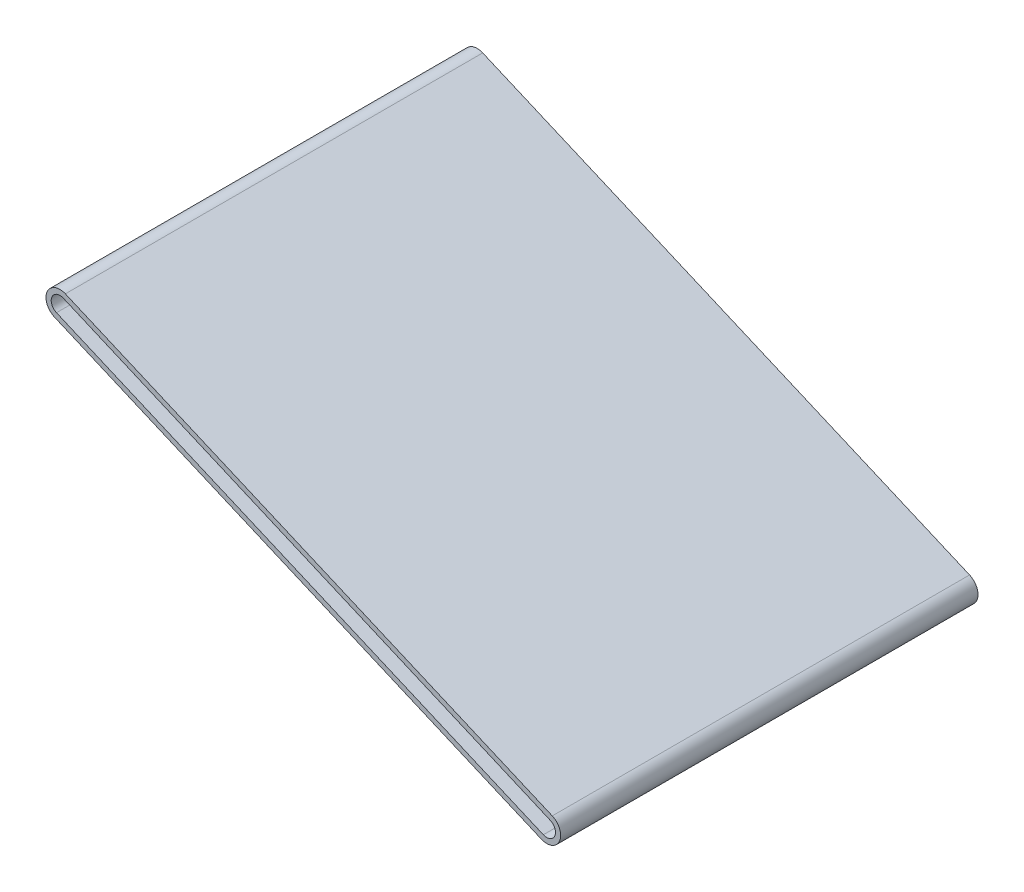
ISO-10303-21;
HEADER;
FILE_DESCRIPTION(('STEP AP214'),'2;1');
FILE_NAME('part.step','',(''),(''),'','','');
FILE_SCHEMA(('AUTOMOTIVE_DESIGN { 1 0 10303 214 1 1 1 1 }'));
ENDSEC;
DATA;
#1=APPLICATION_CONTEXT('core data for automotive mechanical design processes');
#2=APPLICATION_PROTOCOL_DEFINITION('international standard','automotive_design',2000,#1);
#3=PRODUCT_CONTEXT('',#1,'mechanical');
#4=PRODUCT('Part','Part','',(#3));
#5=PRODUCT_RELATED_PRODUCT_CATEGORY('part','',(#4));
#6=PRODUCT_DEFINITION_FORMATION('','',#4);
#7=PRODUCT_DEFINITION_CONTEXT('part definition',#1,'design');
#8=PRODUCT_DEFINITION('design','',#6,#7);
#9=PRODUCT_DEFINITION_SHAPE('','',#8);
#10=(LENGTH_UNIT() NAMED_UNIT(*) SI_UNIT(.MILLI.,.METRE.));
#11=(NAMED_UNIT(*) PLANE_ANGLE_UNIT() SI_UNIT($,.RADIAN.));
#12=(NAMED_UNIT(*) SI_UNIT($,.STERADIAN.) SOLID_ANGLE_UNIT());
#13=UNCERTAINTY_MEASURE_WITH_UNIT(LENGTH_MEASURE(1.E-05),#10,'distance_accuracy_value','');
#14=(GEOMETRIC_REPRESENTATION_CONTEXT(3) GLOBAL_UNCERTAINTY_ASSIGNED_CONTEXT((#13)) GLOBAL_UNIT_ASSIGNED_CONTEXT((#10,
#11,#12)) REPRESENTATION_CONTEXT('',''));
#15=CARTESIAN_POINT('',(0.,0.,0.));
#16=DIRECTION('',(0.,0.,1.));
#17=DIRECTION('',(1.,0.,0.));
#18=AXIS2_PLACEMENT_3D('',#15,#16,#17);
#19=CARTESIAN_POINT('',(0.,0.,304.8));
#20=DIRECTION('',(0.393919298579168,0.919145030018058,0.));
#21=DIRECTION('',(-0.919145030018058,0.393919298579168,0.));
#22=AXIS2_PLACEMENT_3D('',#19,#20,#21);
#23=PLANE('',#22);
#24=DIRECTION('',(0.919145030018058,-0.393919298579168,0.));
#25=VECTOR('',#24,1.);
#26=CARTESIAN_POINT('',(0.,0.,0.));
#27=LINE('',#26,#25);
#28=CARTESIAN_POINT('',(-355.6,152.4,0.));
#29=VERTEX_POINT('',#28);
#30=CARTESIAN_POINT('',(0.,0.,0.));
#31=VERTEX_POINT('',#30);
#32=EDGE_CURVE('E158',#29,#31,#27,.T.);
#33=ORIENTED_EDGE('',*,*,#32,.T.);
#34=DIRECTION('',(0.,0.,-1.));
#35=VECTOR('',#34,1.);
#36=CARTESIAN_POINT('',(0.,0.,304.8));
#37=LINE('',#36,#35);
#38=CARTESIAN_POINT('',(0.,0.,304.8));
#39=VERTEX_POINT('',#38);
#40=EDGE_CURVE('E11',#39,#31,#37,.T.);
#41=ORIENTED_EDGE('',*,*,#40,.F.);
#42=DIRECTION('',(0.919145030018058,-0.393919298579168,0.));
#43=VECTOR('',#42,1.);
#44=CARTESIAN_POINT('',(0.,0.,304.8));
#45=LINE('',#44,#43);
#46=CARTESIAN_POINT('',(-355.6,152.4,304.8));
#47=VERTEX_POINT('',#46);
#48=EDGE_CURVE('E121',#47,#39,#45,.T.);
#49=ORIENTED_EDGE('',*,*,#48,.F.);
#50=DIRECTION('',(0.,0.,-1.));
#51=VECTOR('',#50,1.);
#52=CARTESIAN_POINT('',(-355.6,152.4,304.8));
#53=LINE('',#52,#51);
#54=EDGE_CURVE('E61',#47,#29,#53,.T.);
#55=ORIENTED_EDGE('',*,*,#54,.T.);
#56=EDGE_LOOP('',(#33,#41,#49,#55));
#57=FACE_BOUND('',#56,.T.);
#58=ADVANCED_FACE('F41',(#57),#23,.F.);
#59=CARTESIAN_POINT('',(4.00222007356434,9.33851350498347,304.8));
#60=DIRECTION('',(0.,0.,-1.));
#61=DIRECTION('',(-1.,0.,0.));
#62=AXIS2_PLACEMENT_3D('',#59,#60,#61);
#63=CYLINDRICAL_SURFACE('',#62,10.16);
#64=CARTESIAN_POINT('',(4.00222007356434,9.33851350498347,0.));
#65=DIRECTION('',(0.,0.,1.));
#66=DIRECTION('',(1.,0.,0.));
#67=AXIS2_PLACEMENT_3D('',#64,#65,#66);
#68=CIRCLE('',#67,10.16);
#69=CARTESIAN_POINT('',(8.00444014712869,18.6770270099669,0.));
#70=VERTEX_POINT('',#69);
#71=EDGE_CURVE('E128',#31,#70,#68,.T.);
#72=ORIENTED_EDGE('',*,*,#71,.T.);
#73=DIRECTION('',(0.,0.,-1.));
#74=VECTOR('',#73,1.);
#75=CARTESIAN_POINT('',(8.00444014712869,18.6770270099669,304.8));
#76=LINE('',#75,#74);
#77=CARTESIAN_POINT('',(8.00444014712869,18.6770270099669,304.8));
#78=VERTEX_POINT('',#77);
#79=EDGE_CURVE('E52',#78,#70,#76,.T.);
#80=ORIENTED_EDGE('',*,*,#79,.F.);
#81=CARTESIAN_POINT('',(4.00222007356434,9.33851350498347,304.8));
#82=DIRECTION('',(0.,0.,1.));
#83=DIRECTION('',(1.,0.,0.));
#84=AXIS2_PLACEMENT_3D('',#81,#82,#83);
#85=CIRCLE('',#84,10.16);
#86=EDGE_CURVE('E115',#39,#78,#85,.T.);
#87=ORIENTED_EDGE('',*,*,#86,.F.);
#88=ORIENTED_EDGE('',*,*,#40,.T.);
#89=EDGE_LOOP('',(#72,#80,#87,#88));
#90=FACE_BOUND('',#89,.T.);
#91=ADVANCED_FACE('F127',(#90),#63,.T.);
#92=CARTESIAN_POINT('',(8.00444014712869,18.6770270099669,304.8));
#93=DIRECTION('',(0.393919298579168,0.919145030018058,0.));
#94=DIRECTION('',(-0.919145030018058,0.393919298579168,0.));
#95=AXIS2_PLACEMENT_3D('',#92,#93,#94);
#96=PLANE('',#95);
#97=DIRECTION('',(0.919145030018058,-0.393919298579168,0.));
#98=VECTOR('',#97,1.);
#99=CARTESIAN_POINT('',(8.00444014712869,18.6770270099669,0.));
#100=LINE('',#99,#98);
#101=CARTESIAN_POINT('',(-347.595559852871,171.077027009967,0.));
#102=VERTEX_POINT('',#101);
#103=EDGE_CURVE('E163',#102,#70,#100,.T.);
#104=ORIENTED_EDGE('',*,*,#103,.F.);
#105=DIRECTION('',(0.,0.,-1.));
#106=VECTOR('',#105,1.);
#107=CARTESIAN_POINT('',(-347.595559852871,171.077027009967,304.8));
#108=LINE('',#107,#106);
#109=CARTESIAN_POINT('',(-347.595559852871,171.077027009967,304.8));
#110=VERTEX_POINT('',#109);
#111=EDGE_CURVE('E87',#110,#102,#108,.T.);
#112=ORIENTED_EDGE('',*,*,#111,.F.);
#113=DIRECTION('',(0.919145030018058,-0.393919298579168,0.));
#114=VECTOR('',#113,1.);
#115=CARTESIAN_POINT('',(8.00444014712869,18.6770270099669,304.8));
#116=LINE('',#115,#114);
#117=EDGE_CURVE('E120',#110,#78,#116,.T.);
#118=ORIENTED_EDGE('',*,*,#117,.T.);
#119=ORIENTED_EDGE('',*,*,#79,.T.);
#120=EDGE_LOOP('',(#104,#112,#118,#119));
#121=FACE_BOUND('',#120,.T.);
#122=ADVANCED_FACE('F133',(#121),#96,.T.);
#123=CARTESIAN_POINT('',(4.00222007356434,9.33851350498346,304.8));
#124=DIRECTION('',(0.,0.,-1.));
#125=DIRECTION('',(-1.,0.,0.));
#126=AXIS2_PLACEMENT_3D('',#123,#124,#125);
#127=CYLINDRICAL_SURFACE('',#126,6.34999999999999);
#128=CARTESIAN_POINT('',(4.00222007356434,9.33851350498346,0.));
#129=DIRECTION('',(0.,0.,1.));
#130=DIRECTION('',(1.,0.,0.));
#131=AXIS2_PLACEMENT_3D('',#128,#129,#130);
#132=CIRCLE('',#131,6.34999999999999);
#133=CARTESIAN_POINT('',(1.50083252758663,3.50194256436883,0.));
#134=VERTEX_POINT('',#133);
#135=CARTESIAN_POINT('',(6.50360761954207,15.1750844455981,0.));
#136=VERTEX_POINT('',#135);
#137=EDGE_CURVE('E142',#134,#136,#132,.T.);
#138=ORIENTED_EDGE('',*,*,#137,.F.);
#139=DIRECTION('',(0.,0.,-1.));
#140=VECTOR('',#139,1.);
#141=CARTESIAN_POINT('',(1.50083252758663,3.50194256436883,304.8));
#142=LINE('',#141,#140);
#143=CARTESIAN_POINT('',(1.50083252758663,3.50194256436883,304.8));
#144=VERTEX_POINT('',#143);
#145=EDGE_CURVE('E45',#144,#134,#142,.T.);
#146=ORIENTED_EDGE('',*,*,#145,.F.);
#147=CARTESIAN_POINT('',(4.00222007356434,9.33851350498346,304.8));
#148=DIRECTION('',(0.,0.,1.));
#149=DIRECTION('',(1.,0.,0.));
#150=AXIS2_PLACEMENT_3D('',#147,#148,#149);
#151=CIRCLE('',#150,6.34999999999999);
#152=CARTESIAN_POINT('',(6.50360761954207,15.1750844455981,304.8));
#153=VERTEX_POINT('',#152);
#154=EDGE_CURVE('E170',#144,#153,#151,.T.);
#155=ORIENTED_EDGE('',*,*,#154,.T.);
#156=DIRECTION('',(0.,0.,-1.));
#157=VECTOR('',#156,1.);
#158=CARTESIAN_POINT('',(6.50360761954207,15.1750844455981,304.8));
#159=LINE('',#158,#157);
#160=EDGE_CURVE('E138',#153,#136,#159,.T.);
#161=ORIENTED_EDGE('',*,*,#160,.T.);
#162=EDGE_LOOP('',(#138,#146,#155,#161));
#163=FACE_BOUND('',#162,.T.);
#164=ADVANCED_FACE('F43',(#163),#127,.F.);
#165=CARTESIAN_POINT('',(1.50083252758663,3.50194256436881,304.8));
#166=DIRECTION('',(0.393919298579168,0.919145030018058,0.));
#167=DIRECTION('',(-0.919145030018058,0.393919298579168,0.));
#168=AXIS2_PLACEMENT_3D('',#165,#166,#167);
#169=PLANE('',#168);
#170=DIRECTION('',(0.919145030018058,-0.393919298579168,0.));
#171=VECTOR('',#170,1.);
#172=CARTESIAN_POINT('',(1.50083252758663,3.50194256436881,0.));
#173=LINE('',#172,#171);
#174=CARTESIAN_POINT('',(-354.099167472413,155.901942564369,0.));
#175=VERTEX_POINT('',#174);
#176=EDGE_CURVE('E146',#175,#134,#173,.T.);
#177=ORIENTED_EDGE('',*,*,#176,.F.);
#178=DIRECTION('',(0.,0.,-1.));
#179=VECTOR('',#178,1.);
#180=CARTESIAN_POINT('',(-354.099167472413,155.901942564369,304.8));
#181=LINE('',#180,#179);
#182=CARTESIAN_POINT('',(-354.099167472413,155.901942564369,304.8));
#183=VERTEX_POINT('',#182);
#184=EDGE_CURVE('E179',#183,#175,#181,.T.);
#185=ORIENTED_EDGE('',*,*,#184,.F.);
#186=DIRECTION('',(0.919145030018058,-0.393919298579168,0.));
#187=VECTOR('',#186,1.);
#188=CARTESIAN_POINT('',(1.50083252758663,3.50194256436881,304.8));
#189=LINE('',#188,#187);
#190=EDGE_CURVE('E190',#183,#144,#189,.T.);
#191=ORIENTED_EDGE('',*,*,#190,.T.);
#192=ORIENTED_EDGE('',*,*,#145,.T.);
#193=EDGE_LOOP('',(#177,#185,#191,#192));
#194=FACE_BOUND('',#193,.T.);
#195=ADVANCED_FACE('F188',(#194),#169,.T.);
#196=CARTESIAN_POINT('',(-351.597779926436,161.738513504983,304.8));
#197=DIRECTION('',(0.,0.,-1.));
#198=DIRECTION('',(-1.,0.,0.));
#199=AXIS2_PLACEMENT_3D('',#196,#197,#198);
#200=CYLINDRICAL_SURFACE('',#199,6.34999999999997);
#201=CARTESIAN_POINT('',(-351.597779926436,161.738513504983,0.));
#202=DIRECTION('',(0.,0.,1.));
#203=DIRECTION('',(1.,0.,0.));
#204=AXIS2_PLACEMENT_3D('',#201,#202,#203);
#205=CIRCLE('',#204,6.34999999999997);
#206=CARTESIAN_POINT('',(-349.096392380458,167.575084445598,0.));
#207=VERTEX_POINT('',#206);
#208=EDGE_CURVE('E150',#207,#175,#205,.T.);
#209=ORIENTED_EDGE('',*,*,#208,.F.);
#210=DIRECTION('',(0.,0.,-1.));
#211=VECTOR('',#210,1.);
#212=CARTESIAN_POINT('',(-349.096392380458,167.575084445598,304.8));
#213=LINE('',#212,#211);
#214=CARTESIAN_POINT('',(-349.096392380458,167.575084445598,304.8));
#215=VERTEX_POINT('',#214);
#216=EDGE_CURVE('E177',#215,#207,#213,.T.);
#217=ORIENTED_EDGE('',*,*,#216,.F.);
#218=CARTESIAN_POINT('',(-351.597779926436,161.738513504983,304.8));
#219=DIRECTION('',(0.,0.,1.));
#220=DIRECTION('',(1.,0.,0.));
#221=AXIS2_PLACEMENT_3D('',#218,#219,#220);
#222=CIRCLE('',#221,6.34999999999997);
#223=EDGE_CURVE('E199',#215,#183,#222,.T.);
#224=ORIENTED_EDGE('',*,*,#223,.T.);
#225=ORIENTED_EDGE('',*,*,#184,.T.);
#226=EDGE_LOOP('',(#209,#217,#224,#225));
#227=FACE_BOUND('',#226,.T.);
#228=ADVANCED_FACE('F196',(#227),#200,.F.);
#229=CARTESIAN_POINT('',(6.50360761954204,15.1750844455981,304.8));
#230=DIRECTION('',(0.393919298579168,0.919145030018058,0.));
#231=DIRECTION('',(-0.919145030018058,0.393919298579168,0.));
#232=AXIS2_PLACEMENT_3D('',#229,#230,#231);
#233=PLANE('',#232);
#234=DIRECTION('',(0.919145030018058,-0.393919298579168,0.));
#235=VECTOR('',#234,1.);
#236=CARTESIAN_POINT('',(6.50360761954204,15.1750844455981,0.));
#237=LINE('',#236,#235);
#238=EDGE_CURVE('E154',#207,#136,#237,.T.);
#239=ORIENTED_EDGE('',*,*,#238,.T.);
#240=ORIENTED_EDGE('',*,*,#160,.F.);
#241=DIRECTION('',(0.919145030018058,-0.393919298579168,0.));
#242=VECTOR('',#241,1.);
#243=CARTESIAN_POINT('',(6.50360761954204,15.1750844455981,304.8));
#244=LINE('',#243,#242);
#245=EDGE_CURVE('E201',#215,#153,#244,.T.);
#246=ORIENTED_EDGE('',*,*,#245,.F.);
#247=ORIENTED_EDGE('',*,*,#216,.T.);
#248=EDGE_LOOP('',(#239,#240,#246,#247));
#249=FACE_BOUND('',#248,.T.);
#250=ADVANCED_FACE('F202',(#249),#233,.F.);
#251=CARTESIAN_POINT('',(-351.597779926436,161.738513504983,304.8));
#252=DIRECTION('',(0.,0.,-1.));
#253=DIRECTION('',(-1.,0.,0.));
#254=AXIS2_PLACEMENT_3D('',#251,#252,#253);
#255=CYLINDRICAL_SURFACE('',#254,10.16);
#256=CARTESIAN_POINT('',(-351.597779926436,161.738513504983,0.));
#257=DIRECTION('',(0.,0.,1.));
#258=DIRECTION('',(1.,0.,0.));
#259=AXIS2_PLACEMENT_3D('',#256,#257,#258);
#260=CIRCLE('',#259,10.16);
#261=EDGE_CURVE('E166',#29,#102,#260,.F.);
#262=ORIENTED_EDGE('',*,*,#261,.F.);
#263=ORIENTED_EDGE('',*,*,#54,.F.);
#264=CARTESIAN_POINT('',(-351.597779926436,161.738513504983,304.8));
#265=DIRECTION('',(0.,0.,1.));
#266=DIRECTION('',(1.,0.,0.));
#267=AXIS2_PLACEMENT_3D('',#264,#265,#266);
#268=CIRCLE('',#267,10.16);
#269=EDGE_CURVE('E135',#47,#110,#268,.F.);
#270=ORIENTED_EDGE('',*,*,#269,.T.);
#271=ORIENTED_EDGE('',*,*,#111,.T.);
#272=EDGE_LOOP('',(#262,#263,#270,#271));
#273=FACE_BOUND('',#272,.T.);
#274=ADVANCED_FACE('F214',(#273),#255,.T.);
#275=CARTESIAN_POINT('',(0.,0.,304.8));
#276=DIRECTION('',(0.,0.,1.));
#277=DIRECTION('',(1.,0.,0.));
#278=AXIS2_PLACEMENT_3D('',#275,#276,#277);
#279=PLANE('',#278);
#280=ORIENTED_EDGE('',*,*,#154,.F.);
#281=ORIENTED_EDGE('',*,*,#190,.F.);
#282=ORIENTED_EDGE('',*,*,#223,.F.);
#283=ORIENTED_EDGE('',*,*,#245,.T.);
#284=EDGE_LOOP('',(#280,#281,#282,#283));
#285=FACE_BOUND('',#284,.T.);
#286=ORIENTED_EDGE('',*,*,#48,.T.);
#287=ORIENTED_EDGE('',*,*,#86,.T.);
#288=ORIENTED_EDGE('',*,*,#117,.F.);
#289=ORIENTED_EDGE('',*,*,#269,.F.);
#290=EDGE_LOOP('',(#286,#287,#288,#289));
#291=FACE_BOUND('',#290,.T.);
#292=ADVANCED_FACE('F117',(#285,#291),#279,.T.);
#293=CARTESIAN_POINT('',(0.,0.,0.));
#294=DIRECTION('',(0.,0.,1.));
#295=DIRECTION('',(1.,0.,0.));
#296=AXIS2_PLACEMENT_3D('',#293,#294,#295);
#297=PLANE('',#296);
#298=ORIENTED_EDGE('',*,*,#137,.T.);
#299=ORIENTED_EDGE('',*,*,#238,.F.);
#300=ORIENTED_EDGE('',*,*,#208,.T.);
#301=ORIENTED_EDGE('',*,*,#176,.T.);
#302=EDGE_LOOP('',(#298,#299,#300,#301));
#303=FACE_BOUND('',#302,.T.);
#304=ORIENTED_EDGE('',*,*,#32,.F.);
#305=ORIENTED_EDGE('',*,*,#261,.T.);
#306=ORIENTED_EDGE('',*,*,#103,.T.);
#307=ORIENTED_EDGE('',*,*,#71,.F.);
#308=EDGE_LOOP('',(#304,#305,#306,#307));
#309=FACE_BOUND('',#308,.T.);
#310=ADVANCED_FACE('F194',(#303,#309),#297,.F.);
#311=CLOSED_SHELL('',(#58,#91,#122,#164,#195,#228,#250,#274,#292,#310));
#312=MANIFOLD_SOLID_BREP('B2',#311);
#313=ADVANCED_BREP_SHAPE_REPRESENTATION('',(#18,#312),#14);
#314=SHAPE_DEFINITION_REPRESENTATION(#9,#313);
ENDSEC;
END-ISO-10303-21;
